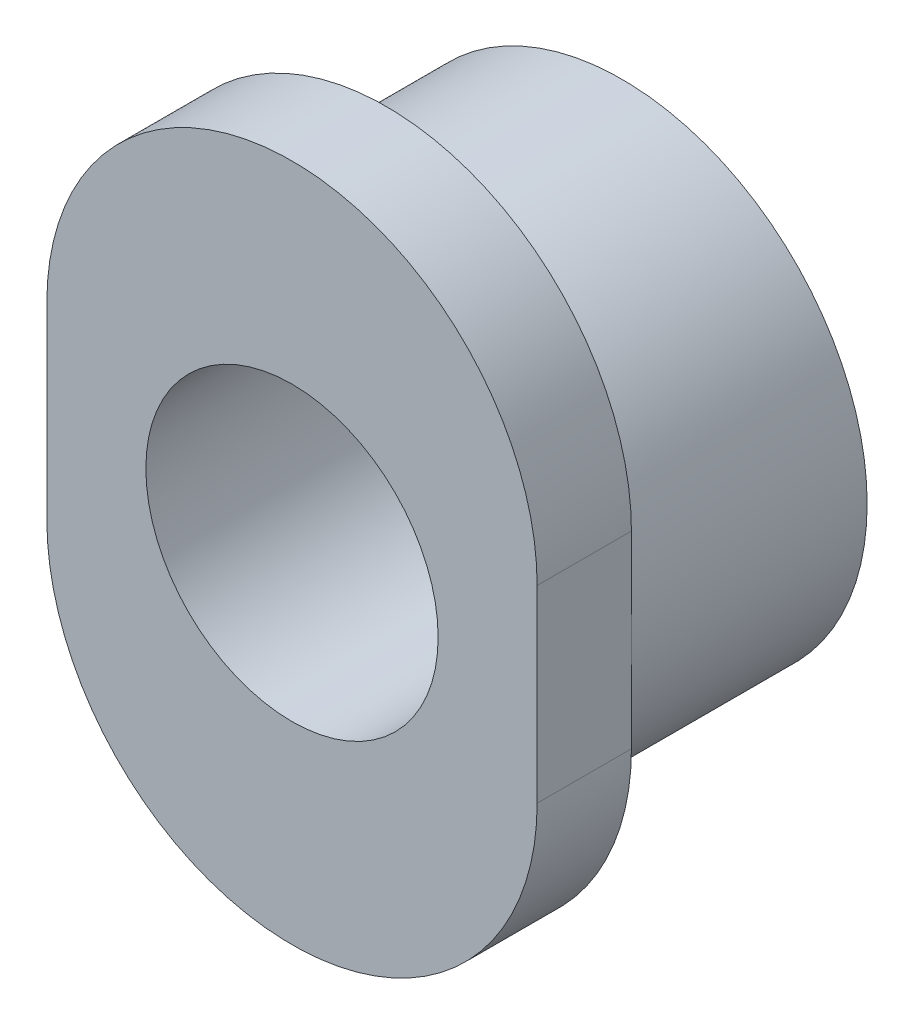
ISO-10303-21;
HEADER;
FILE_DESCRIPTION(('STEP AP214'),'2;1');
FILE_NAME('part.step','',(''),(''),'','','');
FILE_SCHEMA(('AUTOMOTIVE_DESIGN { 1 0 10303 214 1 1 1 1 }'));
ENDSEC;
DATA;
#1=APPLICATION_CONTEXT('core data for automotive mechanical design processes');
#2=APPLICATION_PROTOCOL_DEFINITION('international standard','automotive_design',2000,#1);
#3=PRODUCT_CONTEXT('',#1,'mechanical');
#4=PRODUCT('Part','Part','',(#3));
#5=PRODUCT_RELATED_PRODUCT_CATEGORY('part','',(#4));
#6=PRODUCT_DEFINITION_FORMATION('','',#4);
#7=PRODUCT_DEFINITION_CONTEXT('part definition',#1,'design');
#8=PRODUCT_DEFINITION('design','',#6,#7);
#9=PRODUCT_DEFINITION_SHAPE('','',#8);
#10=(LENGTH_UNIT() NAMED_UNIT(*) SI_UNIT(.MILLI.,.METRE.));
#11=(NAMED_UNIT(*) PLANE_ANGLE_UNIT() SI_UNIT($,.RADIAN.));
#12=(NAMED_UNIT(*) SI_UNIT($,.STERADIAN.) SOLID_ANGLE_UNIT());
#13=UNCERTAINTY_MEASURE_WITH_UNIT(LENGTH_MEASURE(1.E-05),#10,'distance_accuracy_value','');
#14=(GEOMETRIC_REPRESENTATION_CONTEXT(3) GLOBAL_UNCERTAINTY_ASSIGNED_CONTEXT((#13)) GLOBAL_UNIT_ASSIGNED_CONTEXT((#10,
#11,#12)) REPRESENTATION_CONTEXT('',''));
#15=CARTESIAN_POINT('',(0.,0.,0.));
#16=DIRECTION('',(0.,0.,1.));
#17=DIRECTION('',(1.,0.,0.));
#18=AXIS2_PLACEMENT_3D('',#15,#16,#17);
#19=CARTESIAN_POINT('',(0.,0.,0.));
#20=DIRECTION('',(0.,0.,1.));
#21=DIRECTION('',(1.,0.,0.));
#22=AXIS2_PLACEMENT_3D('',#19,#20,#21);
#23=PLANE('',#22);
#24=CARTESIAN_POINT('',(0.,0.,0.));
#25=DIRECTION('',(0.,0.,1.));
#26=DIRECTION('',(1.,0.,0.));
#27=AXIS2_PLACEMENT_3D('',#24,#25,#26);
#28=CIRCLE('',#27,2.6);
#29=CARTESIAN_POINT('',(2.6,0.,0.));
#30=VERTEX_POINT('',#29);
#31=EDGE_CURVE('E43',#30,#30,#28,.T.);
#32=ORIENTED_EDGE('',*,*,#31,.F.);
#33=EDGE_LOOP('',(#32));
#34=FACE_BOUND('',#33,.T.);
#35=CARTESIAN_POINT('',(0.,0.,0.));
#36=DIRECTION('',(0.,0.,1.));
#37=DIRECTION('',(1.,0.,0.));
#38=AXIS2_PLACEMENT_3D('',#35,#36,#37);
#39=CIRCLE('',#38,1.55);
#40=CARTESIAN_POINT('',(1.55,0.,0.));
#41=VERTEX_POINT('',#40);
#42=EDGE_CURVE('E108',#41,#41,#39,.T.);
#43=ORIENTED_EDGE('',*,*,#42,.T.);
#44=EDGE_LOOP('',(#43));
#45=FACE_BOUND('',#44,.T.);
#46=ADVANCED_FACE('F39',(#34,#45),#23,.F.);
#47=CARTESIAN_POINT('',(0.,0.,2.5));
#48=DIRECTION('',(0.,0.,-1.));
#49=DIRECTION('',(-1.,0.,0.));
#50=AXIS2_PLACEMENT_3D('',#47,#48,#49);
#51=CYLINDRICAL_SURFACE('',#50,2.6);
#52=CARTESIAN_POINT('',(0.,0.,2.5));
#53=DIRECTION('',(0.,0.,1.));
#54=DIRECTION('',(1.,0.,0.));
#55=AXIS2_PLACEMENT_3D('',#52,#53,#54);
#56=CIRCLE('',#55,2.6);
#57=CARTESIAN_POINT('',(2.6,0.,2.5));
#58=VERTEX_POINT('',#57);
#59=CARTESIAN_POINT('',(-2.6,0.,2.5));
#60=VERTEX_POINT('',#59);
#61=EDGE_CURVE('E11',#58,#60,#56,.T.);
#62=ORIENTED_EDGE('',*,*,#61,.F.);
#63=EDGE_CURVE('E48',#60,#58,#56,.T.);
#64=ORIENTED_EDGE('',*,*,#63,.F.);
#65=EDGE_LOOP('',(#62,#64));
#66=FACE_BOUND('',#65,.T.);
#67=ORIENTED_EDGE('',*,*,#31,.T.);
#68=EDGE_LOOP('',(#67));
#69=FACE_BOUND('',#68,.T.);
#70=ADVANCED_FACE('F41',(#66,#69),#51,.T.);
#71=CARTESIAN_POINT('',(0.,0.,2.5));
#72=DIRECTION('',(0.,0.,-1.));
#73=DIRECTION('',(-1.,0.,0.));
#74=AXIS2_PLACEMENT_3D('',#71,#72,#73);
#75=CYLINDRICAL_SURFACE('',#74,1.55);
#76=ORIENTED_EDGE('',*,*,#42,.F.);
#77=EDGE_LOOP('',(#76));
#78=FACE_BOUND('',#77,.T.);
#79=CARTESIAN_POINT('',(0.,0.,3.5));
#80=DIRECTION('',(0.,0.,1.));
#81=DIRECTION('',(1.,0.,0.));
#82=AXIS2_PLACEMENT_3D('',#79,#80,#81);
#83=CIRCLE('',#82,1.55);
#84=CARTESIAN_POINT('',(1.55,0.,3.5));
#85=VERTEX_POINT('',#84);
#86=EDGE_CURVE('E128',#85,#85,#83,.T.);
#87=ORIENTED_EDGE('',*,*,#86,.T.);
#88=EDGE_LOOP('',(#87));
#89=FACE_BOUND('',#88,.T.);
#90=ADVANCED_FACE('F134',(#78,#89),#75,.F.);
#91=CARTESIAN_POINT('',(0.,-1.,2.5));
#92=DIRECTION('',(0.,0.,1.));
#93=DIRECTION('',(1.,0.,0.));
#94=AXIS2_PLACEMENT_3D('',#91,#92,#93);
#95=PLANE('',#94);
#96=DIRECTION('',(0.,1.,0.));
#97=VECTOR('',#96,1.);
#98=CARTESIAN_POINT('',(2.6,-1.,2.5));
#99=LINE('',#98,#97);
#100=CARTESIAN_POINT('',(2.6,1.,2.5));
#101=VERTEX_POINT('',#100);
#102=EDGE_CURVE('E126',#58,#101,#99,.T.);
#103=ORIENTED_EDGE('',*,*,#102,.F.);
#104=ORIENTED_EDGE('',*,*,#61,.T.);
#105=DIRECTION('',(0.,-1.,0.));
#106=VECTOR('',#105,1.);
#107=CARTESIAN_POINT('',(-2.6,-1.,2.5));
#108=LINE('',#107,#106);
#109=CARTESIAN_POINT('',(-2.6,0.999999999999999,2.5));
#110=VERTEX_POINT('',#109);
#111=EDGE_CURVE('E103',#110,#60,#108,.T.);
#112=ORIENTED_EDGE('',*,*,#111,.F.);
#113=CARTESIAN_POINT('',(0.,1.,2.5));
#114=DIRECTION('',(0.,0.,1.));
#115=DIRECTION('',(1.,0.,0.));
#116=AXIS2_PLACEMENT_3D('',#113,#114,#115);
#117=CIRCLE('',#116,2.6);
#118=EDGE_CURVE('E122',#101,#110,#117,.T.);
#119=ORIENTED_EDGE('',*,*,#118,.F.);
#120=EDGE_LOOP('',(#103,#104,#112,#119));
#121=FACE_BOUND('',#120,.T.);
#122=ADVANCED_FACE('F143',(#121),#95,.F.);
#123=CARTESIAN_POINT('',(-2.6,-1.,2.5));
#124=VERTEX_POINT('',#123);
#125=EDGE_CURVE('E121',#60,#124,#108,.T.);
#126=ORIENTED_EDGE('',*,*,#125,.F.);
#127=ORIENTED_EDGE('',*,*,#63,.T.);
#128=CARTESIAN_POINT('',(2.6,-1.,2.5));
#129=VERTEX_POINT('',#128);
#130=EDGE_CURVE('E124',#129,#58,#99,.T.);
#131=ORIENTED_EDGE('',*,*,#130,.F.);
#132=CARTESIAN_POINT('',(0.,-1.,2.5));
#133=DIRECTION('',(0.,0.,1.));
#134=DIRECTION('',(1.,0.,0.));
#135=AXIS2_PLACEMENT_3D('',#132,#133,#134);
#136=CIRCLE('',#135,2.6);
#137=EDGE_CURVE('E107',#124,#129,#136,.T.);
#138=ORIENTED_EDGE('',*,*,#137,.F.);
#139=EDGE_LOOP('',(#126,#127,#131,#138));
#140=FACE_BOUND('',#139,.T.);
#141=ADVANCED_FACE('F136',(#140),#95,.F.);
#142=CARTESIAN_POINT('',(0.,-1.,3.5));
#143=DIRECTION('',(0.,0.,1.));
#144=DIRECTION('',(1.,0.,0.));
#145=AXIS2_PLACEMENT_3D('',#142,#143,#144);
#146=PLANE('',#145);
#147=CARTESIAN_POINT('',(0.,-1.,3.5));
#148=DIRECTION('',(0.,0.,1.));
#149=DIRECTION('',(1.,0.,0.));
#150=AXIS2_PLACEMENT_3D('',#147,#148,#149);
#151=CIRCLE('',#150,2.6);
#152=CARTESIAN_POINT('',(-2.6,-1.,3.5));
#153=VERTEX_POINT('',#152);
#154=CARTESIAN_POINT('',(2.6,-1.,3.5));
#155=VERTEX_POINT('',#154);
#156=EDGE_CURVE('E93',#153,#155,#151,.T.);
#157=ORIENTED_EDGE('',*,*,#156,.T.);
#158=DIRECTION('',(0.,1.,0.));
#159=VECTOR('',#158,1.);
#160=CARTESIAN_POINT('',(2.6,-1.,3.5));
#161=LINE('',#160,#159);
#162=CARTESIAN_POINT('',(2.6,1.,3.5));
#163=VERTEX_POINT('',#162);
#164=EDGE_CURVE('E81',#155,#163,#161,.T.);
#165=ORIENTED_EDGE('',*,*,#164,.T.);
#166=CARTESIAN_POINT('',(0.,1.,3.5));
#167=DIRECTION('',(0.,0.,1.));
#168=DIRECTION('',(1.,0.,0.));
#169=AXIS2_PLACEMENT_3D('',#166,#167,#168);
#170=CIRCLE('',#169,2.6);
#171=CARTESIAN_POINT('',(-2.6,0.999999999999999,3.5));
#172=VERTEX_POINT('',#171);
#173=EDGE_CURVE('E92',#163,#172,#170,.T.);
#174=ORIENTED_EDGE('',*,*,#173,.T.);
#175=DIRECTION('',(0.,-1.,0.));
#176=VECTOR('',#175,1.);
#177=CARTESIAN_POINT('',(-2.6,-1.,3.5));
#178=LINE('',#177,#176);
#179=EDGE_CURVE('E99',#172,#153,#178,.T.);
#180=ORIENTED_EDGE('',*,*,#179,.T.);
#181=EDGE_LOOP('',(#157,#165,#174,#180));
#182=FACE_BOUND('',#181,.T.);
#183=ORIENTED_EDGE('',*,*,#86,.F.);
#184=EDGE_LOOP('',(#183));
#185=FACE_BOUND('',#184,.T.);
#186=ADVANCED_FACE('F96',(#182,#185),#146,.T.);
#187=CARTESIAN_POINT('',(0.,-1.,3.5));
#188=DIRECTION('',(0.,0.,-1.));
#189=DIRECTION('',(-1.,0.,0.));
#190=AXIS2_PLACEMENT_3D('',#187,#188,#189);
#191=CYLINDRICAL_SURFACE('',#190,2.6);
#192=ORIENTED_EDGE('',*,*,#137,.T.);
#193=DIRECTION('',(0.,0.,-1.));
#194=VECTOR('',#193,1.);
#195=CARTESIAN_POINT('',(2.6,-1.,3.5));
#196=LINE('',#195,#194);
#197=EDGE_CURVE('E86',#155,#129,#196,.T.);
#198=ORIENTED_EDGE('',*,*,#197,.F.);
#199=ORIENTED_EDGE('',*,*,#156,.F.);
#200=DIRECTION('',(0.,0.,-1.));
#201=VECTOR('',#200,1.);
#202=CARTESIAN_POINT('',(-2.6,-1.,3.5));
#203=LINE('',#202,#201);
#204=EDGE_CURVE('E117',#153,#124,#203,.T.);
#205=ORIENTED_EDGE('',*,*,#204,.T.);
#206=EDGE_LOOP('',(#192,#198,#199,#205));
#207=FACE_BOUND('',#206,.T.);
#208=ADVANCED_FACE('F105',(#207),#191,.T.);
#209=CARTESIAN_POINT('',(2.6,-1.,3.5));
#210=DIRECTION('',(-1.,0.,0.));
#211=DIRECTION('',(0.,-1.,0.));
#212=AXIS2_PLACEMENT_3D('',#209,#210,#211);
#213=PLANE('',#212);
#214=ORIENTED_EDGE('',*,*,#130,.T.);
#215=ORIENTED_EDGE('',*,*,#102,.T.);
#216=DIRECTION('',(0.,0.,-1.));
#217=VECTOR('',#216,1.);
#218=CARTESIAN_POINT('',(2.6,1.,3.5));
#219=LINE('',#218,#217);
#220=EDGE_CURVE('E89',#163,#101,#219,.T.);
#221=ORIENTED_EDGE('',*,*,#220,.F.);
#222=ORIENTED_EDGE('',*,*,#164,.F.);
#223=ORIENTED_EDGE('',*,*,#197,.T.);
#224=EDGE_LOOP('',(#214,#215,#221,#222,#223));
#225=FACE_BOUND('',#224,.T.);
#226=ADVANCED_FACE('F84',(#225),#213,.F.);
#227=CARTESIAN_POINT('',(0.,1.,3.5));
#228=DIRECTION('',(0.,0.,-1.));
#229=DIRECTION('',(-1.,0.,0.));
#230=AXIS2_PLACEMENT_3D('',#227,#228,#229);
#231=CYLINDRICAL_SURFACE('',#230,2.6);
#232=ORIENTED_EDGE('',*,*,#118,.T.);
#233=DIRECTION('',(0.,0.,-1.));
#234=VECTOR('',#233,1.);
#235=CARTESIAN_POINT('',(-2.6,0.999999999999999,3.5));
#236=LINE('',#235,#234);
#237=EDGE_CURVE('E112',#172,#110,#236,.T.);
#238=ORIENTED_EDGE('',*,*,#237,.F.);
#239=ORIENTED_EDGE('',*,*,#173,.F.);
#240=ORIENTED_EDGE('',*,*,#220,.T.);
#241=EDGE_LOOP('',(#232,#238,#239,#240));
#242=FACE_BOUND('',#241,.T.);
#243=ADVANCED_FACE('F159',(#242),#231,.T.);
#244=CARTESIAN_POINT('',(-2.6,-1.,3.5));
#245=DIRECTION('',(1.,0.,0.));
#246=DIRECTION('',(0.,1.,0.));
#247=AXIS2_PLACEMENT_3D('',#244,#245,#246);
#248=PLANE('',#247);
#249=ORIENTED_EDGE('',*,*,#111,.T.);
#250=ORIENTED_EDGE('',*,*,#125,.T.);
#251=ORIENTED_EDGE('',*,*,#204,.F.);
#252=ORIENTED_EDGE('',*,*,#179,.F.);
#253=ORIENTED_EDGE('',*,*,#237,.T.);
#254=EDGE_LOOP('',(#249,#250,#251,#252,#253));
#255=FACE_BOUND('',#254,.T.);
#256=ADVANCED_FACE('F162',(#255),#248,.F.);
#257=CLOSED_SHELL('',(#46,#70,#90,#122,#141,#186,#208,#226,#243,#256));
#258=MANIFOLD_SOLID_BREP('B2',#257);
#259=ADVANCED_BREP_SHAPE_REPRESENTATION('',(#18,#258),#14);
#260=SHAPE_DEFINITION_REPRESENTATION(#9,#259);
ENDSEC;
END-ISO-10303-21;
